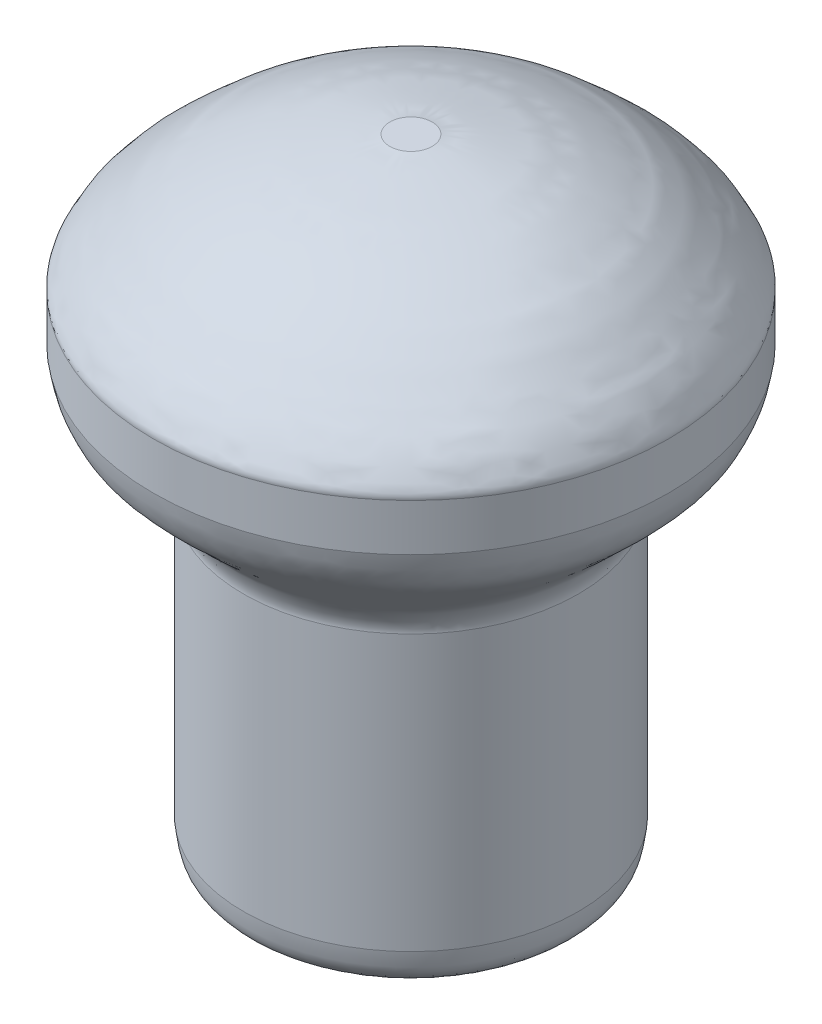
ISO-10303-21;
HEADER;
FILE_DESCRIPTION(('STEP AP214'),'2;1');
FILE_NAME('part.step','',(''),(''),'','','');
FILE_SCHEMA(('AUTOMOTIVE_DESIGN { 1 0 10303 214 1 1 1 1 }'));
ENDSEC;
DATA;
#1=APPLICATION_CONTEXT('core data for automotive mechanical design processes');
#2=APPLICATION_PROTOCOL_DEFINITION('international standard','automotive_design',2000,#1);
#3=PRODUCT_CONTEXT('',#1,'mechanical');
#4=PRODUCT('Part','Part','',(#3));
#5=PRODUCT_RELATED_PRODUCT_CATEGORY('part','',(#4));
#6=PRODUCT_DEFINITION_FORMATION('','',#4);
#7=PRODUCT_DEFINITION_CONTEXT('part definition',#1,'design');
#8=PRODUCT_DEFINITION('design','',#6,#7);
#9=PRODUCT_DEFINITION_SHAPE('','',#8);
#10=(LENGTH_UNIT() NAMED_UNIT(*) SI_UNIT(.MILLI.,.METRE.));
#11=(NAMED_UNIT(*) PLANE_ANGLE_UNIT() SI_UNIT($,.RADIAN.));
#12=(NAMED_UNIT(*) SI_UNIT($,.STERADIAN.) SOLID_ANGLE_UNIT());
#13=UNCERTAINTY_MEASURE_WITH_UNIT(LENGTH_MEASURE(1.E-05),#10,'distance_accuracy_value','');
#14=(GEOMETRIC_REPRESENTATION_CONTEXT(3) GLOBAL_UNCERTAINTY_ASSIGNED_CONTEXT((#13)) GLOBAL_UNIT_ASSIGNED_CONTEXT((#10,
#11,#12)) REPRESENTATION_CONTEXT('',''));
#15=CARTESIAN_POINT('',(0.,0.,0.));
#16=DIRECTION('',(0.,0.,1.));
#17=DIRECTION('',(1.,0.,0.));
#18=AXIS2_PLACEMENT_3D('',#15,#16,#17);
#19=CARTESIAN_POINT('',(-3.44435922200666,158.000000663065,0.));
#20=DIRECTION('',(0.,-1.,0.));
#21=DIRECTION('',(1.,0.,0.));
#22=AXIS2_PLACEMENT_3D('',#19,#20,#21);
#23=PLANE('',#22);
#24=CARTESIAN_POINT('',(-3.44435922200666,158.000000663065,0.));
#25=DIRECTION('',(0.,-1.,0.));
#26=DIRECTION('',(1.,0.,0.));
#27=AXIS2_PLACEMENT_3D('',#24,#25,#26);
#28=CIRCLE('',#27,3.29680710935444);
#29=CARTESIAN_POINT('',(-0.147552112652213,158.000000663065,0.));
#30=VERTEX_POINT('',#29);
#31=EDGE_CURVE('E56',#30,#30,#28,.T.);
#32=ORIENTED_EDGE('',*,*,#31,.F.);
#33=EDGE_LOOP('',(#32));
#34=FACE_BOUND('',#33,.T.);
#35=ADVANCED_FACE('F31',(#34),#23,.F.);
#36=CARTESIAN_POINT('',(-0.147552112652213,158.000000663065,0.));
#37=CARTESIAN_POINT('',(0.752810398506495,157.839631266421,0.));
#38=CARTESIAN_POINT('',(2.25467156794928,157.815957346699,0.));
#39=CARTESIAN_POINT('',(4.24913768860144,157.42969170768,0.));
#40=CARTESIAN_POINT('',(5.82785625619828,157.156322339063,0.));
#41=CARTESIAN_POINT('',(7.30633153372499,156.853770710727,0.));
#42=CARTESIAN_POINT('',(8.73727344227142,156.557718534589,0.));
#43=CARTESIAN_POINT('',(10.1927926236751,156.313021033669,0.));
#44=CARTESIAN_POINT('',(11.4199837790999,155.91166677248,0.));
#45=CARTESIAN_POINT('',(12.4671368973733,155.566233217264,0.));
#46=CARTESIAN_POINT('',(13.3656489931429,155.249118960795,0.));
#47=CARTESIAN_POINT('',(14.2895078447928,155.014944924373,0.));
#48=CARTESIAN_POINT('',(15.3935577408124,154.641634269685,0.));
#49=CARTESIAN_POINT('',(16.4866159005615,154.193493736991,0.));
#50=CARTESIAN_POINT('',(17.6242295494371,153.694847200565,0.));
#51=CARTESIAN_POINT('',(18.6965962446196,153.262699901517,0.));
#52=CARTESIAN_POINT('',(19.7712297733717,152.685639731566,0.));
#53=CARTESIAN_POINT('',(20.9927363914489,152.116319480558,0.));
#54=CARTESIAN_POINT('',(22.2318443206355,151.351842670149,0.));
#55=CARTESIAN_POINT('',(23.6621985392132,150.751797909452,0.));
#56=CARTESIAN_POINT('',(24.9874337303704,149.783230305053,0.));
#57=CARTESIAN_POINT('',(26.2878001217026,148.893883423043,0.));
#58=CARTESIAN_POINT('',(27.6136106102099,147.930025749134,0.));
#59=CARTESIAN_POINT('',(28.7515792571919,146.858119022295,0.));
#60=CARTESIAN_POINT('',(29.8934326958842,145.850348536143,0.));
#61=CARTESIAN_POINT('',(31.0095242544417,144.964611829062,0.));
#62=CARTESIAN_POINT('',(31.945178306856,143.886673636216,0.));
#63=CARTESIAN_POINT('',(33.0634586719236,143.094911082276,0.));
#64=CARTESIAN_POINT('',(33.8498305833852,142.020839773503,0.));
#65=CARTESIAN_POINT('',(34.6789128950345,141.123784157933,0.));
#66=CARTESIAN_POINT('',(35.4604580881512,140.096129676233,0.));
#67=CARTESIAN_POINT('',(36.0280885617237,138.634911320729,0.));
#68=CARTESIAN_POINT('',(36.8330138938241,137.734041187309,0.));
#69=CARTESIAN_POINT('',(36.6906418447844,136.929125624309,0.));
#70=B_SPLINE_CURVE_WITH_KNOTS('',3,(#36,#37,#38,#39,#40,#41,#42,#43,#44,#45,#46,#47,#48,#49,#50,
#51,#52,#53,#54,#55,#56,#57,#58,#59,#60,#61,#62,#63,#64,#65,#66,#67,#68,#69),.UNSPECIFIED.,.F.,
.F.,(4,1,1,1,1,1,1,1,1,1,1,1,1,1,1,1,1,1,1,1,1,1,1,1,1,1,1,1,1,1,1,4),(0.,0.0615848644268745,
0.100794932353676,0.136830734936231,0.169700167196271,0.202568950002438,0.235437770861158,
0.269088287988468,0.289472528241397,0.309858244293199,0.333318893762607,0.353706297975795,
0.388422523153927,0.412964694721672,0.437513727289155,0.466339542289087,0.495168076467247,
0.528353593993954,0.564387378827147,0.599250152815559,0.63859311596508,0.670823766800798,
0.709635235111035,0.743897497788843,0.773611536743798,0.805518573365873,0.839782543764674,
0.864952923184065,0.894669657821522,0.92239475175108,0.951224043651229,1.),.UNSPECIFIED.);
#71=CARTESIAN_POINT('',(-3.44435922200666,158.000000663065,0.));
#72=DIRECTION('',(0.,-1.,0.));
#73=AXIS1_PLACEMENT('',#71,#72);
#74=SURFACE_OF_REVOLUTION('',#70,#73);
#75=CARTESIAN_POINT('',(-3.44435922200666,136.929125624309,0.));
#76=DIRECTION('',(0.,-1.,0.));
#77=DIRECTION('',(1.,0.,0.));
#78=AXIS2_PLACEMENT_3D('',#75,#76,#77);
#79=CIRCLE('',#78,40.135001066791);
#80=CARTESIAN_POINT('',(36.6906418447844,136.929125624309,0.));
#81=VERTEX_POINT('',#80);
#82=EDGE_CURVE('E53',#81,#81,#79,.T.);
#83=ORIENTED_EDGE('',*,*,#82,.F.);
#84=EDGE_LOOP('',(#83));
#85=FACE_BOUND('',#84,.T.);
#86=ORIENTED_EDGE('',*,*,#31,.T.);
#87=EDGE_LOOP('',(#86));
#88=FACE_BOUND('',#87,.T.);
#89=ADVANCED_FACE('F74',(#85,#88),#74,.T.);
#90=CARTESIAN_POINT('',(-3.44435922200666,158.000000663065,0.));
#91=DIRECTION('',(0.,-1.,0.));
#92=DIRECTION('',(1.,0.,0.));
#93=AXIS2_PLACEMENT_3D('',#90,#91,#92);
#94=CYLINDRICAL_SURFACE('',#93,40.135001066791);
#95=CARTESIAN_POINT('',(-3.44435922200666,129.618823673656,0.));
#96=DIRECTION('',(0.,-1.,0.));
#97=DIRECTION('',(1.,0.,0.));
#98=AXIS2_PLACEMENT_3D('',#95,#96,#97);
#99=CIRCLE('',#98,40.135001066791);
#100=CARTESIAN_POINT('',(36.6906418447844,129.618823673656,0.));
#101=VERTEX_POINT('',#100);
#102=EDGE_CURVE('E48',#101,#101,#99,.T.);
#103=ORIENTED_EDGE('',*,*,#102,.F.);
#104=EDGE_LOOP('',(#103));
#105=FACE_BOUND('',#104,.T.);
#106=ORIENTED_EDGE('',*,*,#82,.T.);
#107=EDGE_LOOP('',(#106));
#108=FACE_BOUND('',#107,.T.);
#109=ADVANCED_FACE('F78',(#105,#108),#94,.T.);
#110=CARTESIAN_POINT('',(36.6906418447844,129.618823673656,0.));
#111=CARTESIAN_POINT('',(36.5192263531223,128.713139617419,0.));
#112=CARTESIAN_POINT('',(36.3425343293628,127.368854610872,0.));
#113=CARTESIAN_POINT('',(35.6651176981769,125.690071061629,0.));
#114=CARTESIAN_POINT('',(35.1574960690814,124.459886772489,0.));
#115=CARTESIAN_POINT('',(34.3973957962575,123.239215664027,0.));
#116=CARTESIAN_POINT('',(33.475141212584,122.227943295312,0.));
#117=CARTESIAN_POINT('',(32.4788492446589,121.265101849722,0.));
#118=CARTESIAN_POINT('',(31.5296880837487,120.251458488581,0.));
#119=CARTESIAN_POINT('',(30.386703152126,119.346264323249,0.));
#120=CARTESIAN_POINT('',(29.3788961463478,118.296585872149,0.));
#121=CARTESIAN_POINT('',(28.4257727264328,117.286750944214,0.));
#122=CARTESIAN_POINT('',(27.3224564446069,116.438718877527,0.));
#123=CARTESIAN_POINT('',(26.4298229837812,115.464372876021,0.));
#124=CARTESIAN_POINT('',(25.4160551986079,114.515150439003,0.));
#125=CARTESIAN_POINT('',(24.6123405886368,113.511909602148,0.));
#126=CARTESIAN_POINT('',(23.6994223948126,112.556908895579,0.));
#127=CARTESIAN_POINT('',(23.0524714396485,111.028730659966,0.));
#128=CARTESIAN_POINT('',(22.5637103623616,109.85671053562,0.));
#129=CARTESIAN_POINT('',(22.6433969784135,108.97797815188,0.));
#130=B_SPLINE_CURVE_WITH_KNOTS('',3,(#110,#111,#112,#113,#114,#115,#116,#117,#118,#119,#120,
#121,#122,#123,#124,#125,#126,#127,#128,#129),.UNSPECIFIED.,.F.,.F.,(4,1,1,1,1,1,1,1,1,1,1,1,1,
1,1,1,1,4),(0.,0.108355707665725,0.156009901810115,0.210945136353364,0.263562196346495,
0.322855399043406,0.370185869969219,0.42539950719397,0.484692345657507,0.539908975697014,
0.595125987599847,0.646549262164152,0.701764349492994,0.749092888972323,0.808384474183945,
0.851949680069623,0.901837268680756,1.),.UNSPECIFIED.);
#131=CARTESIAN_POINT('',(-3.44435922200666,158.000000663065,0.));
#132=DIRECTION('',(0.,-1.,0.));
#133=AXIS1_PLACEMENT('',#131,#132);
#134=SURFACE_OF_REVOLUTION('',#130,#133);
#135=CARTESIAN_POINT('',(-3.44435922200665,108.97797815188,0.));
#136=DIRECTION('',(0.,-1.,0.));
#137=DIRECTION('',(1.,0.,0.));
#138=AXIS2_PLACEMENT_3D('',#135,#136,#137);
#139=CIRCLE('',#138,26.0877562004201);
#140=CARTESIAN_POINT('',(22.6433969784135,108.97797815188,0.));
#141=VERTEX_POINT('',#140);
#142=EDGE_CURVE('E44',#141,#141,#139,.T.);
#143=ORIENTED_EDGE('',*,*,#142,.F.);
#144=EDGE_LOOP('',(#143));
#145=FACE_BOUND('',#144,.T.);
#146=ORIENTED_EDGE('',*,*,#102,.T.);
#147=EDGE_LOOP('',(#146));
#148=FACE_BOUND('',#147,.T.);
#149=ADVANCED_FACE('F82',(#145,#148),#134,.T.);
#150=CARTESIAN_POINT('',(-3.44435922200666,158.000000663065,0.));
#151=DIRECTION('',(0.,-1.,0.));
#152=DIRECTION('',(1.,0.,0.));
#153=AXIS2_PLACEMENT_3D('',#150,#151,#152);
#154=CYLINDRICAL_SURFACE('',#153,26.0877562004201);
#155=CARTESIAN_POINT('',(-3.44435922200665,66.1195178823558,0.));
#156=DIRECTION('',(0.,-1.,0.));
#157=DIRECTION('',(1.,0.,0.));
#158=AXIS2_PLACEMENT_3D('',#155,#156,#157);
#159=CIRCLE('',#158,26.0877562004201);
#160=CARTESIAN_POINT('',(22.6433969784134,66.1195178823558,0.));
#161=VERTEX_POINT('',#160);
#162=EDGE_CURVE('E40',#161,#161,#159,.T.);
#163=ORIENTED_EDGE('',*,*,#162,.F.);
#164=EDGE_LOOP('',(#163));
#165=FACE_BOUND('',#164,.T.);
#166=ORIENTED_EDGE('',*,*,#142,.T.);
#167=EDGE_LOOP('',(#166));
#168=FACE_BOUND('',#167,.T.);
#169=ADVANCED_FACE('F84',(#165,#168),#154,.T.);
#170=CARTESIAN_POINT('',(18.1998634160237,60.0992679245778,0.));
#171=CARTESIAN_POINT('',(18.5139915587438,60.1509055482642,0.));
#172=CARTESIAN_POINT('',(18.9605451757356,60.1529751644364,0.));
#173=CARTESIAN_POINT('',(19.4515995996123,60.3320845541607,0.));
#174=CARTESIAN_POINT('',(19.9956715644679,60.7493720551389,0.));
#175=CARTESIAN_POINT('',(20.7999464081927,61.2013583430776,0.));
#176=CARTESIAN_POINT('',(21.5622394494436,61.9724398026541,0.));
#177=CARTESIAN_POINT('',(22.1352458013641,62.9522209848838,0.));
#178=CARTESIAN_POINT('',(22.4178633822423,64.3930420583279,0.));
#179=CARTESIAN_POINT('',(22.5784614182763,65.443642051662,0.));
#180=CARTESIAN_POINT('',(22.6433969784135,66.1195178823558,0.));
#181=B_SPLINE_CURVE_WITH_KNOTS('',3,(#170,#171,#172,#173,#174,#175,#176,#177,#178,#179,#180),
.UNSPECIFIED.,.F.,.F.,(4,1,1,1,1,1,1,1,4),(0.,0.0919240044132616,0.112491347202395,
0.205673427891337,0.333713757734475,0.459267324426669,0.602422929602104,0.748839040688865,1.),.UNSPECIFIED.);
#182=CARTESIAN_POINT('',(-3.44435922200666,158.000000663065,0.));
#183=DIRECTION('',(0.,-1.,0.));
#184=AXIS1_PLACEMENT('',#182,#183);
#185=SURFACE_OF_REVOLUTION('',#181,#184);
#186=ORIENTED_EDGE('',*,*,#162,.T.);
#187=EDGE_LOOP('',(#186));
#188=FACE_BOUND('',#187,.T.);
#189=CARTESIAN_POINT('',(-3.44435922200665,60.0992679245778,0.));
#190=DIRECTION('',(0.,-1.,0.));
#191=DIRECTION('',(1.,0.,0.));
#192=AXIS2_PLACEMENT_3D('',#189,#190,#191);
#193=CIRCLE('',#192,21.6442226380304);
#194=CARTESIAN_POINT('',(18.1998634160237,60.0992679245778,0.));
#195=VERTEX_POINT('',#194);
#196=EDGE_CURVE('E59',#195,#195,#193,.T.);
#197=ORIENTED_EDGE('',*,*,#196,.F.);
#198=EDGE_LOOP('',(#197));
#199=FACE_BOUND('',#198,.T.);
#200=ADVANCED_FACE('F33',(#188,#199),#185,.F.);
#201=CARTESIAN_POINT('',(18.1998634160237,60.0992679245778,0.));
#202=DIRECTION('',(0.,1.,0.));
#203=DIRECTION('',(-1.,0.,0.));
#204=AXIS2_PLACEMENT_3D('',#201,#202,#203);
#205=PLANE('',#204);
#206=ORIENTED_EDGE('',*,*,#196,.T.);
#207=EDGE_LOOP('',(#206));
#208=FACE_BOUND('',#207,.T.);
#209=ADVANCED_FACE('F91',(#208),#205,.F.);
#210=CLOSED_SHELL('',(#35,#89,#109,#149,#169,#200,#209));
#211=CARTESIAN_POINT('',(6.19435094264239,58.1257544090611,0.));
#212=CARTESIAN_POINT('',(8.35138047828658,58.4803354360186,0.));
#213=CARTESIAN_POINT('',(10.5084100139308,58.8349164629761,0.));
#214=CARTESIAN_POINT('',(14.2467035114175,59.4494318998319,0.));
#215=CARTESIAN_POINT('',(15.82796747326,59.7093663097303,0.));
#216=CARTESIAN_POINT('',(17.6727754287429,60.0126231212784,0.));
#217=CARTESIAN_POINT('',(17.9363194223833,60.0559455229281,0.));
#218=CARTESIAN_POINT('',(18.4634074096642,60.1425903262275,0.));
#219=CARTESIAN_POINT('',(18.7626938553098,60.1507569435378,0.));
#220=CARTESIAN_POINT('',(19.2324162308381,60.2313944286354,0.));
#221=CARTESIAN_POINT('',(19.4672774186023,60.2717131711842,0.));
#222=CARTESIAN_POINT('',(21.1113057329514,60.5539443690259,0.));
#223=CARTESIAN_POINT('',(22.5204728595363,60.7958568243188,0.));
#224=CARTESIAN_POINT('',(23.9296399861212,61.0377692796116,0.));
#225=B_SPLINE_CURVE_WITH_KNOTS('',3,(#211,#212,#213,#214,#215,#216,#217,#218,#219,#220,#221,
#222,#223,#224),.UNSPECIFIED.,.F.,.F.,(4,2,2,2,2,2,4),(-1.17106644444568,-0.539850180798826,
-0.0771214543998324,0.,0.0771214543998324,0.154242908799665,0.616971635198659),.UNSPECIFIED.);
#226=CARTESIAN_POINT('',(-3.44435922200666,158.000000663065,0.));
#227=DIRECTION('',(0.,-1.,0.));
#228=AXIS1_PLACEMENT('',#226,#227);
#229=SURFACE_OF_REVOLUTION('',#225,#228);
#230=OFFSET_SURFACE('',#229,2.,.F.);
#231=CARTESIAN_POINT('',(-3.44435922200665,62.1482118299812,0.));
#232=DIRECTION('',(0.,-1.,0.));
#233=DIRECTION('',(1.,0.,0.));
#234=AXIS2_PLACEMENT_3D('',#231,#232,#233);
#235=CIRCLE('',#234,21.98164026477);
#236=CARTESIAN_POINT('',(18.5372810427633,62.1482118299812,0.));
#237=VERTEX_POINT('',#236);
#238=EDGE_CURVE('E248',#237,#237,#235,.T.);
#239=ORIENTED_EDGE('',*,*,#238,.F.);
#240=EDGE_LOOP('',(#239));
#241=FACE_BOUND('',#240,.T.);
#242=CARTESIAN_POINT('',(-3.44435922200665,62.0992679245778,0.));
#243=DIRECTION('',(0.,-1.,0.));
#244=DIRECTION('',(1.,0.,0.));
#245=AXIS2_PLACEMENT_3D('',#242,#243,#244);
#246=CIRCLE('',#245,21.5018143341362);
#247=CARTESIAN_POINT('',(18.0574551121295,62.0992679245778,0.));
#248=VERTEX_POINT('',#247);
#249=EDGE_CURVE('E10',#248,#248,#246,.F.);
#250=ORIENTED_EDGE('',*,*,#249,.F.);
#251=EDGE_LOOP('',(#250));
#252=FACE_BOUND('',#251,.T.);
#253=ADVANCED_FACE('F125',(#241,#252),#230,.T.);
#254=CARTESIAN_POINT('',(19.4153918692793,60.3402330724493,0.));
#255=CARTESIAN_POINT('',(19.5862173637441,60.434506698964,0.));
#256=CARTESIAN_POINT('',(20.0411348888471,60.7749215291574,0.));
#257=CARTESIAN_POINT('',(20.7999464081927,61.2013583430776,0.));
#258=CARTESIAN_POINT('',(21.5622394494436,61.9724398026541,0.));
#259=CARTESIAN_POINT('',(22.1352458013641,62.9522209848838,0.));
#260=CARTESIAN_POINT('',(22.4178633822423,64.3930420583279,0.));
#261=CARTESIAN_POINT('',(22.5784614182763,65.443642051662,0.));
#262=CARTESIAN_POINT('',(22.6433969784135,66.1195178823558,0.));
#263=B_SPLINE_CURVE_WITH_KNOTS('',3,(#254,#255,#256,#257,#258,#259,#260,#261,#262),
.UNSPECIFIED.,.F.,.F.,(4,1,1,1,1,1,4),(0.132093587484397,0.205673427891337,0.333713757734475,
0.459267324426669,0.602422929602104,0.748839040688865,1.),.UNSPECIFIED.);
#264=CARTESIAN_POINT('',(-3.44435922200666,158.000000663065,0.));
#265=DIRECTION('',(0.,-1.,0.));
#266=AXIS1_PLACEMENT('',#264,#265);
#267=SURFACE_OF_REVOLUTION('',#263,#266);
#268=OFFSET_SURFACE('',#267,2.,.F.);
#269=ORIENTED_EDGE('',*,*,#238,.T.);
#270=EDGE_LOOP('',(#269));
#271=FACE_BOUND('',#270,.T.);
#272=CARTESIAN_POINT('',(-3.44435922200665,66.2181098309633,0.));
#273=DIRECTION('',(0.,-1.,0.));
#274=DIRECTION('',(1.,0.,0.));
#275=AXIS2_PLACEMENT_3D('',#272,#273,#274);
#276=CIRCLE('',#275,24.0877562004201);
#277=CARTESIAN_POINT('',(20.6433969784134,66.2181098309633,0.));
#278=VERTEX_POINT('',#277);
#279=EDGE_CURVE('E254',#278,#278,#276,.T.);
#280=ORIENTED_EDGE('',*,*,#279,.F.);
#281=EDGE_LOOP('',(#280));
#282=FACE_BOUND('',#281,.T.);
#283=ADVANCED_FACE('F119',(#271,#282),#268,.T.);
#284=CARTESIAN_POINT('',(-3.44435922200666,158.000000663065,0.));
#285=DIRECTION('',(0.,-1.,0.));
#286=DIRECTION('',(1.,0.,0.));
#287=AXIS2_PLACEMENT_3D('',#284,#285,#286);
#288=CYLINDRICAL_SURFACE('',#287,24.0877562004201);
#289=ORIENTED_EDGE('',*,*,#279,.T.);
#290=EDGE_LOOP('',(#289));
#291=FACE_BOUND('',#290,.T.);
#292=CARTESIAN_POINT('',(-3.44435922200665,108.899071826464,0.));
#293=DIRECTION('',(0.,-1.,0.));
#294=DIRECTION('',(1.,0.,0.));
#295=AXIS2_PLACEMENT_3D('',#292,#293,#294);
#296=CIRCLE('',#295,24.0877562004201);
#297=CARTESIAN_POINT('',(20.6433969784135,108.899071826464,0.));
#298=VERTEX_POINT('',#297);
#299=EDGE_CURVE('E251',#298,#298,#296,.T.);
#300=ORIENTED_EDGE('',*,*,#299,.F.);
#301=EDGE_LOOP('',(#300));
#302=FACE_BOUND('',#301,.T.);
#303=ADVANCED_FACE('F124',(#291,#302),#288,.F.);
#304=CARTESIAN_POINT('',(36.6906418447844,129.618823673656,0.));
#305=CARTESIAN_POINT('',(36.5192263531223,128.713139617419,0.));
#306=CARTESIAN_POINT('',(36.3425343293628,127.368854610872,0.));
#307=CARTESIAN_POINT('',(35.6651176981769,125.690071061629,0.));
#308=CARTESIAN_POINT('',(35.1574960690814,124.459886772489,0.));
#309=CARTESIAN_POINT('',(34.3973957962575,123.239215664027,0.));
#310=CARTESIAN_POINT('',(33.475141212584,122.227943295312,0.));
#311=CARTESIAN_POINT('',(32.4788492446589,121.265101849722,0.));
#312=CARTESIAN_POINT('',(31.5296880837487,120.251458488581,0.));
#313=CARTESIAN_POINT('',(30.386703152126,119.346264323249,0.));
#314=CARTESIAN_POINT('',(29.3788961463478,118.296585872149,0.));
#315=CARTESIAN_POINT('',(28.4257727264328,117.286750944214,0.));
#316=CARTESIAN_POINT('',(27.3224564446069,116.438718877527,0.));
#317=CARTESIAN_POINT('',(26.4298229837812,115.464372876021,0.));
#318=CARTESIAN_POINT('',(25.4160551986079,114.515150439003,0.));
#319=CARTESIAN_POINT('',(24.6123405886368,113.511909602148,0.));
#320=CARTESIAN_POINT('',(23.6994223948126,112.556908895579,0.));
#321=CARTESIAN_POINT('',(23.0524714396485,111.028730659966,0.));
#322=CARTESIAN_POINT('',(22.5637103623616,109.85671053562,0.));
#323=CARTESIAN_POINT('',(22.6433969784135,108.97797815188,0.));
#324=B_SPLINE_CURVE_WITH_KNOTS('',3,(#304,#305,#306,#307,#308,#309,#310,#311,#312,#313,#314,
#315,#316,#317,#318,#319,#320,#321,#322,#323),.UNSPECIFIED.,.F.,.F.,(4,1,1,1,1,1,1,1,1,1,1,1,1,
1,1,1,1,4),(0.,0.108355707665725,0.156009901810115,0.210945136353364,0.263562196346495,
0.322855399043406,0.370185869969219,0.42539950719397,0.484692345657507,0.539908975697014,
0.595125987599847,0.646549262164152,0.701764349492994,0.749092888972323,0.808384474183945,
0.851949680069623,0.901837268680756,1.),.UNSPECIFIED.);
#325=CARTESIAN_POINT('',(-3.44435922200666,158.000000663065,0.));
#326=DIRECTION('',(0.,-1.,0.));
#327=AXIS1_PLACEMENT('',#325,#326);
#328=SURFACE_OF_REVOLUTION('',#324,#327);
#329=OFFSET_SURFACE('',#328,-2.,.F.);
#330=ORIENTED_EDGE('',*,*,#299,.T.);
#331=EDGE_LOOP('',(#330));
#332=FACE_BOUND('',#331,.T.);
#333=CARTESIAN_POINT('',(-3.44435922200666,129.802969095276,0.));
#334=DIRECTION('',(0.,-1.,0.));
#335=DIRECTION('',(1.,0.,0.));
#336=AXIS2_PLACEMENT_3D('',#333,#334,#335);
#337=CIRCLE('',#336,38.135001066791);
#338=CARTESIAN_POINT('',(34.6906418447844,129.802969095276,0.));
#339=VERTEX_POINT('',#338);
#340=EDGE_CURVE('E245',#339,#339,#337,.T.);
#341=ORIENTED_EDGE('',*,*,#340,.F.);
#342=EDGE_LOOP('',(#341));
#343=FACE_BOUND('',#342,.T.);
#344=ADVANCED_FACE('F138',(#332,#343),#329,.F.);
#345=CARTESIAN_POINT('',(-3.44435922200666,158.000000663065,0.));
#346=DIRECTION('',(0.,-1.,0.));
#347=DIRECTION('',(1.,0.,0.));
#348=AXIS2_PLACEMENT_3D('',#345,#346,#347);
#349=CYLINDRICAL_SURFACE('',#348,38.135001066791);
#350=ORIENTED_EDGE('',*,*,#340,.T.);
#351=EDGE_LOOP('',(#350));
#352=FACE_BOUND('',#351,.T.);
#353=CARTESIAN_POINT('',(-3.44435922200666,137.179651659898,0.));
#354=DIRECTION('',(0.,-1.,0.));
#355=DIRECTION('',(1.,0.,0.));
#356=AXIS2_PLACEMENT_3D('',#353,#354,#355);
#357=CIRCLE('',#356,38.1350010667911);
#358=CARTESIAN_POINT('',(34.6906418447844,137.179651659898,0.));
#359=VERTEX_POINT('',#358);
#360=EDGE_CURVE('E62',#359,#359,#357,.T.);
#361=ORIENTED_EDGE('',*,*,#360,.F.);
#362=EDGE_LOOP('',(#361));
#363=FACE_BOUND('',#362,.T.);
#364=ADVANCED_FACE('F148',(#352,#363),#349,.F.);
#365=CARTESIAN_POINT('',(-0.147552112652213,158.000000663065,0.));
#366=CARTESIAN_POINT('',(0.752810398506495,157.839631266421,0.));
#367=CARTESIAN_POINT('',(2.25467156794928,157.815957346699,0.));
#368=CARTESIAN_POINT('',(4.24913768860144,157.42969170768,0.));
#369=CARTESIAN_POINT('',(5.82785625619828,157.156322339063,0.));
#370=CARTESIAN_POINT('',(7.30633153372499,156.853770710727,0.));
#371=CARTESIAN_POINT('',(8.73727344227142,156.557718534589,0.));
#372=CARTESIAN_POINT('',(10.1927926236751,156.313021033669,0.));
#373=CARTESIAN_POINT('',(11.4199837790999,155.91166677248,0.));
#374=CARTESIAN_POINT('',(12.4671368973733,155.566233217264,0.));
#375=CARTESIAN_POINT('',(13.3656489931429,155.249118960795,0.));
#376=CARTESIAN_POINT('',(14.2895078447928,155.014944924373,0.));
#377=CARTESIAN_POINT('',(15.3935577408124,154.641634269685,0.));
#378=CARTESIAN_POINT('',(16.4866159005615,154.193493736991,0.));
#379=CARTESIAN_POINT('',(17.6242295494371,153.694847200565,0.));
#380=CARTESIAN_POINT('',(18.6965962446196,153.262699901517,0.));
#381=CARTESIAN_POINT('',(19.7712297733717,152.685639731566,0.));
#382=CARTESIAN_POINT('',(20.9927363914489,152.116319480558,0.));
#383=CARTESIAN_POINT('',(22.2318443206355,151.351842670149,0.));
#384=CARTESIAN_POINT('',(23.6621985392132,150.751797909452,0.));
#385=CARTESIAN_POINT('',(24.9874337303704,149.783230305053,0.));
#386=CARTESIAN_POINT('',(26.2878001217026,148.893883423043,0.));
#387=CARTESIAN_POINT('',(27.6136106102099,147.930025749134,0.));
#388=CARTESIAN_POINT('',(28.7515792571919,146.858119022295,0.));
#389=CARTESIAN_POINT('',(29.8934326958842,145.850348536143,0.));
#390=CARTESIAN_POINT('',(31.0095242544417,144.964611829062,0.));
#391=CARTESIAN_POINT('',(31.945178306856,143.886673636216,0.));
#392=CARTESIAN_POINT('',(33.0634586719236,143.094911082276,0.));
#393=CARTESIAN_POINT('',(33.8498305833852,142.020839773503,0.));
#394=CARTESIAN_POINT('',(34.6789128950345,141.123784157933,0.));
#395=CARTESIAN_POINT('',(35.4604580881512,140.096129676233,0.));
#396=CARTESIAN_POINT('',(35.9316806452401,138.883088653942,0.));
#397=CARTESIAN_POINT('',(36.4824599145671,138.158717112717,0.));
#398=CARTESIAN_POINT('',(36.6251966210054,137.733653439234,0.));
#399=B_SPLINE_CURVE_WITH_KNOTS('',3,(#365,#366,#367,#368,#369,#370,#371,#372,#373,#374,#375,
#376,#377,#378,#379,#380,#381,#382,#383,#384,#385,#386,#387,#388,#389,#390,#391,#392,#393,#394,
#395,#396,#397,#398),.UNSPECIFIED.,.F.,.F.,(4,1,1,1,1,1,1,1,1,1,1,1,1,1,1,1,1,1,1,1,1,1,1,1,1,1,
1,1,1,1,1,4),(0.,0.0615848644268745,0.100794932353676,0.136830734936231,0.169700167196271,
0.202568950002438,0.235437770861158,0.269088287988468,0.289472528241397,0.309858244293199,
0.333318893762607,0.353706297975795,0.388422523153927,0.412964694721672,0.437513727289155,
0.466339542289087,0.495168076467247,0.528353593993954,0.564387378827147,0.599250152815559,
0.63859311596508,0.670823766800798,0.709635235111035,0.743897497788843,0.773611536743798,
0.805518573365873,0.839782543764674,0.864952923184065,0.894669657821522,0.92239475175108,
0.951224043651229,0.982110405792673),.UNSPECIFIED.);
#400=CARTESIAN_POINT('',(-3.44435922200666,158.000000663065,0.));
#401=DIRECTION('',(0.,-1.,0.));
#402=AXIS1_PLACEMENT('',#400,#401);
#403=SURFACE_OF_REVOLUTION('',#399,#402);
#404=OFFSET_SURFACE('',#403,-2.,.F.);
#405=ORIENTED_EDGE('',*,*,#360,.T.);
#406=EDGE_LOOP('',(#405));
#407=FACE_BOUND('',#406,.T.);
#408=CARTESIAN_POINT('',(-3.44435922200666,156.000000663065,0.));
#409=DIRECTION('',(0.,-1.,0.));
#410=DIRECTION('',(1.,0.,0.));
#411=AXIS2_PLACEMENT_3D('',#408,#409,#410);
#412=CIRCLE('',#411,3.12916986266735);
#413=CARTESIAN_POINT('',(-0.315189359339305,156.000000663065,0.));
#414=VERTEX_POINT('',#413);
#415=EDGE_CURVE('E215',#414,#414,#412,.T.);
#416=ORIENTED_EDGE('',*,*,#415,.F.);
#417=EDGE_LOOP('',(#416));
#418=FACE_BOUND('',#417,.T.);
#419=ADVANCED_FACE('F158',(#407,#418),#404,.F.);
#420=CARTESIAN_POINT('',(-3.44435922200666,156.000000663065,0.));
#421=DIRECTION('',(0.,-1.,0.));
#422=DIRECTION('',(1.,0.,0.));
#423=AXIS2_PLACEMENT_3D('',#420,#421,#422);
#424=PLANE('',#423);
#425=ORIENTED_EDGE('',*,*,#415,.T.);
#426=EDGE_LOOP('',(#425));
#427=FACE_BOUND('',#426,.T.);
#428=ADVANCED_FACE('F168',(#427),#424,.T.);
#429=CARTESIAN_POINT('',(-3.44435922200665,62.0992679245778,0.));
#430=DIRECTION('',(0.,-1.,0.));
#431=DIRECTION('',(1.,0.,0.));
#432=AXIS2_PLACEMENT_3D('',#429,#430,#431);
#433=PLANE('',#432);
#434=ORIENTED_EDGE('',*,*,#249,.T.);
#435=EDGE_LOOP('',(#434));
#436=FACE_BOUND('',#435,.T.);
#437=ADVANCED_FACE('F178',(#436),#433,.F.);
#438=CLOSED_SHELL('',(#253,#283,#303,#344,#364,#419,#428,#437));
#439=ORIENTED_CLOSED_SHELL('',*,#438,.T.);
#440=BREP_WITH_VOIDS('B2',#210,(#439));
#441=ADVANCED_BREP_SHAPE_REPRESENTATION('',(#18,#440),#14);
#442=SHAPE_DEFINITION_REPRESENTATION(#9,#441);
ENDSEC;
END-ISO-10303-21;
